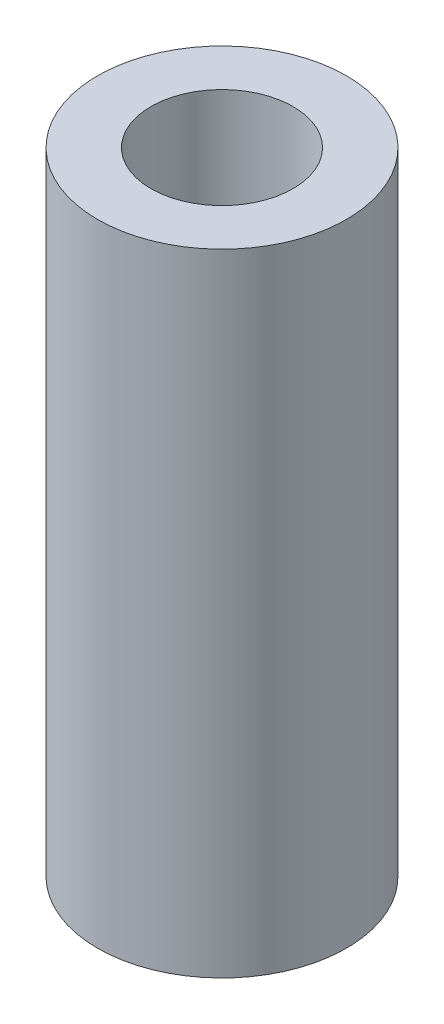
ISO-10303-21;
HEADER;
FILE_DESCRIPTION(('STEP AP214'),'2;1');
FILE_NAME('part.step','',(''),(''),'','','');
FILE_SCHEMA(('AUTOMOTIVE_DESIGN { 1 0 10303 214 1 1 1 1 }'));
ENDSEC;
DATA;
#1=APPLICATION_CONTEXT('core data for automotive mechanical design processes');
#2=APPLICATION_PROTOCOL_DEFINITION('international standard','automotive_design',2000,#1);
#3=PRODUCT_CONTEXT('',#1,'mechanical');
#4=PRODUCT('Part','Part','',(#3));
#5=PRODUCT_RELATED_PRODUCT_CATEGORY('part','',(#4));
#6=PRODUCT_DEFINITION_FORMATION('','',#4);
#7=PRODUCT_DEFINITION_CONTEXT('part definition',#1,'design');
#8=PRODUCT_DEFINITION('design','',#6,#7);
#9=PRODUCT_DEFINITION_SHAPE('','',#8);
#10=(LENGTH_UNIT() NAMED_UNIT(*) SI_UNIT(.MILLI.,.METRE.));
#11=(NAMED_UNIT(*) PLANE_ANGLE_UNIT() SI_UNIT($,.RADIAN.));
#12=(NAMED_UNIT(*) SI_UNIT($,.STERADIAN.) SOLID_ANGLE_UNIT());
#13=UNCERTAINTY_MEASURE_WITH_UNIT(LENGTH_MEASURE(1.E-05),#10,'distance_accuracy_value','');
#14=(GEOMETRIC_REPRESENTATION_CONTEXT(3) GLOBAL_UNCERTAINTY_ASSIGNED_CONTEXT((#13)) GLOBAL_UNIT_ASSIGNED_CONTEXT((#10,
#11,#12)) REPRESENTATION_CONTEXT('',''));
#15=CARTESIAN_POINT('',(0.,0.,0.));
#16=DIRECTION('',(0.,0.,1.));
#17=DIRECTION('',(1.,0.,0.));
#18=AXIS2_PLACEMENT_3D('',#15,#16,#17);
#19=CARTESIAN_POINT('',(0.,0.,0.));
#20=DIRECTION('',(0.,-1.,0.));
#21=DIRECTION('',(0.,0.,-1.));
#22=AXIS2_PLACEMENT_3D('',#19,#20,#21);
#23=PLANE('',#22);
#24=CARTESIAN_POINT('',(0.,0.,0.));
#25=DIRECTION('',(0.,1.,0.));
#26=DIRECTION('',(0.,0.,1.));
#27=AXIS2_PLACEMENT_3D('',#24,#25,#26);
#28=CIRCLE('',#27,8.);
#29=CARTESIAN_POINT('',(0.,0.,8.));
#30=VERTEX_POINT('',#29);
#31=EDGE_CURVE('E43',#30,#30,#28,.T.);
#32=ORIENTED_EDGE('',*,*,#31,.T.);
#33=EDGE_LOOP('',(#32));
#34=FACE_BOUND('',#33,.T.);
#35=CARTESIAN_POINT('',(0.,0.,0.));
#36=DIRECTION('',(0.,-1.,0.));
#37=DIRECTION('',(0.,0.,-1.));
#38=AXIS2_PLACEMENT_3D('',#35,#36,#37);
#39=CIRCLE('',#38,14.);
#40=CARTESIAN_POINT('',(0.,0.,-14.));
#41=VERTEX_POINT('',#40);
#42=EDGE_CURVE('E39',#41,#41,#39,.T.);
#43=ORIENTED_EDGE('',*,*,#42,.T.);
#44=EDGE_LOOP('',(#43));
#45=FACE_BOUND('',#44,.T.);
#46=ADVANCED_FACE('F33',(#34,#45),#23,.T.);
#47=CARTESIAN_POINT('',(0.,71.,0.));
#48=DIRECTION('',(0.,1.,0.));
#49=DIRECTION('',(0.,0.,1.));
#50=AXIS2_PLACEMENT_3D('',#47,#48,#49);
#51=PLANE('',#50);
#52=CARTESIAN_POINT('',(0.,71.,0.));
#53=DIRECTION('',(0.,1.,0.));
#54=DIRECTION('',(0.,0.,1.));
#55=AXIS2_PLACEMENT_3D('',#52,#53,#54);
#56=CIRCLE('',#55,8.);
#57=CARTESIAN_POINT('',(0.,71.,8.));
#58=VERTEX_POINT('',#57);
#59=EDGE_CURVE('E47',#58,#58,#56,.T.);
#60=ORIENTED_EDGE('',*,*,#59,.F.);
#61=EDGE_LOOP('',(#60));
#62=FACE_BOUND('',#61,.T.);
#63=CARTESIAN_POINT('',(0.,71.,0.));
#64=DIRECTION('',(0.,-1.,0.));
#65=DIRECTION('',(0.,0.,-1.));
#66=AXIS2_PLACEMENT_3D('',#63,#64,#65);
#67=CIRCLE('',#66,14.);
#68=CARTESIAN_POINT('',(0.,71.,-14.));
#69=VERTEX_POINT('',#68);
#70=EDGE_CURVE('E10',#69,#69,#67,.T.);
#71=ORIENTED_EDGE('',*,*,#70,.F.);
#72=EDGE_LOOP('',(#71));
#73=FACE_BOUND('',#72,.T.);
#74=ADVANCED_FACE('F55',(#62,#73),#51,.T.);
#75=CARTESIAN_POINT('',(0.,0.,0.));
#76=DIRECTION('',(0.,-1.,0.));
#77=DIRECTION('',(0.,0.,-1.));
#78=AXIS2_PLACEMENT_3D('',#75,#76,#77);
#79=CYLINDRICAL_SURFACE('',#78,14.);
#80=ORIENTED_EDGE('',*,*,#70,.T.);
#81=EDGE_LOOP('',(#80));
#82=FACE_BOUND('',#81,.T.);
#83=ORIENTED_EDGE('',*,*,#42,.F.);
#84=EDGE_LOOP('',(#83));
#85=FACE_BOUND('',#84,.T.);
#86=ADVANCED_FACE('F58',(#82,#85),#79,.T.);
#87=CARTESIAN_POINT('',(0.,0.,0.));
#88=DIRECTION('',(0.,1.,0.));
#89=DIRECTION('',(0.,0.,1.));
#90=AXIS2_PLACEMENT_3D('',#87,#88,#89);
#91=CYLINDRICAL_SURFACE('',#90,8.);
#92=ORIENTED_EDGE('',*,*,#31,.F.);
#93=EDGE_LOOP('',(#92));
#94=FACE_BOUND('',#93,.T.);
#95=ORIENTED_EDGE('',*,*,#59,.T.);
#96=EDGE_LOOP('',(#95));
#97=FACE_BOUND('',#96,.T.);
#98=ADVANCED_FACE('F53',(#94,#97),#91,.F.);
#99=CLOSED_SHELL('',(#46,#74,#86,#98));
#100=MANIFOLD_SOLID_BREP('B2',#99);
#101=ADVANCED_BREP_SHAPE_REPRESENTATION('',(#18,#100),#14);
#102=SHAPE_DEFINITION_REPRESENTATION(#9,#101);
ENDSEC;
END-ISO-10303-21;
